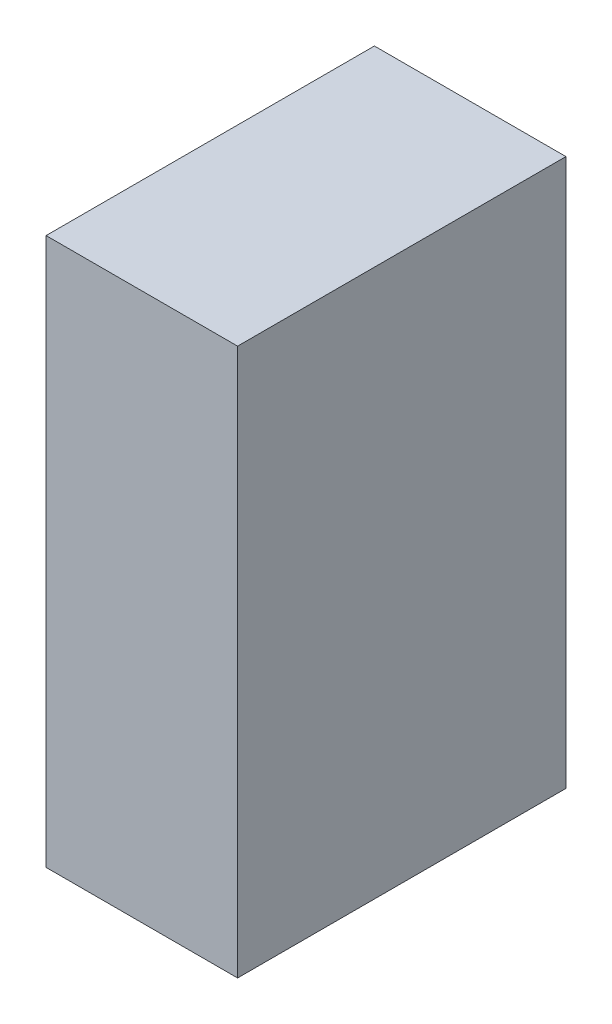
ISO-10303-21;
HEADER;
FILE_DESCRIPTION(('STEP AP214'),'2;1');
FILE_NAME('part.step','',(''),(''),'','','');
FILE_SCHEMA(('AUTOMOTIVE_DESIGN { 1 0 10303 214 1 1 1 1 }'));
ENDSEC;
DATA;
#1=APPLICATION_CONTEXT('core data for automotive mechanical design processes');
#2=APPLICATION_PROTOCOL_DEFINITION('international standard','automotive_design',2000,#1);
#3=PRODUCT_CONTEXT('',#1,'mechanical');
#4=PRODUCT('Part','Part','',(#3));
#5=PRODUCT_RELATED_PRODUCT_CATEGORY('part','',(#4));
#6=PRODUCT_DEFINITION_FORMATION('','',#4);
#7=PRODUCT_DEFINITION_CONTEXT('part definition',#1,'design');
#8=PRODUCT_DEFINITION('design','',#6,#7);
#9=PRODUCT_DEFINITION_SHAPE('','',#8);
#10=(LENGTH_UNIT() NAMED_UNIT(*) SI_UNIT(.MILLI.,.METRE.));
#11=(NAMED_UNIT(*) PLANE_ANGLE_UNIT() SI_UNIT($,.RADIAN.));
#12=(NAMED_UNIT(*) SI_UNIT($,.STERADIAN.) SOLID_ANGLE_UNIT());
#13=UNCERTAINTY_MEASURE_WITH_UNIT(LENGTH_MEASURE(1.E-05),#10,'distance_accuracy_value','');
#14=(GEOMETRIC_REPRESENTATION_CONTEXT(3) GLOBAL_UNCERTAINTY_ASSIGNED_CONTEXT((#13)) GLOBAL_UNIT_ASSIGNED_CONTEXT((#10,
#11,#12)) REPRESENTATION_CONTEXT('',''));
#15=CARTESIAN_POINT('',(0.,0.,0.));
#16=DIRECTION('',(0.,0.,1.));
#17=DIRECTION('',(1.,0.,0.));
#18=AXIS2_PLACEMENT_3D('',#15,#16,#17);
#19=CARTESIAN_POINT('',(610.,180.,-248.));
#20=DIRECTION('',(-1.,0.,0.));
#21=DIRECTION('',(0.,0.,1.));
#22=AXIS2_PLACEMENT_3D('',#19,#20,#21);
#23=PLANE('',#22);
#24=DIRECTION('',(0.,-1.,0.));
#25=VECTOR('',#24,1.);
#26=CARTESIAN_POINT('',(610.,180.,-188.));
#27=LINE('',#26,#25);
#28=CARTESIAN_POINT('',(610.,280.,-188.));
#29=VERTEX_POINT('',#28);
#30=CARTESIAN_POINT('',(610.,180.,-188.));
#31=VERTEX_POINT('',#30);
#32=EDGE_CURVE('E103',#29,#31,#27,.T.);
#33=ORIENTED_EDGE('',*,*,#32,.F.);
#34=DIRECTION('',(0.,0.,1.));
#35=VECTOR('',#34,1.);
#36=CARTESIAN_POINT('',(610.,280.,-248.));
#37=LINE('',#36,#35);
#38=CARTESIAN_POINT('',(610.,280.,-248.));
#39=VERTEX_POINT('',#38);
#40=EDGE_CURVE('E11',#39,#29,#37,.T.);
#41=ORIENTED_EDGE('',*,*,#40,.F.);
#42=DIRECTION('',(0.,-1.,0.));
#43=VECTOR('',#42,1.);
#44=CARTESIAN_POINT('',(610.,180.,-248.));
#45=LINE('',#44,#43);
#46=CARTESIAN_POINT('',(610.,180.,-248.));
#47=VERTEX_POINT('',#46);
#48=EDGE_CURVE('E97',#39,#47,#45,.T.);
#49=ORIENTED_EDGE('',*,*,#48,.T.);
#50=DIRECTION('',(0.,0.,1.));
#51=VECTOR('',#50,1.);
#52=CARTESIAN_POINT('',(610.,180.,-248.));
#53=LINE('',#52,#51);
#54=EDGE_CURVE('E42',#47,#31,#53,.T.);
#55=ORIENTED_EDGE('',*,*,#54,.T.);
#56=EDGE_LOOP('',(#33,#41,#49,#55));
#57=FACE_BOUND('',#56,.T.);
#58=ADVANCED_FACE('F39',(#57),#23,.T.);
#59=CARTESIAN_POINT('',(610.,280.,-248.));
#60=DIRECTION('',(0.,1.,0.));
#61=DIRECTION('',(0.,0.,1.));
#62=AXIS2_PLACEMENT_3D('',#59,#60,#61);
#63=PLANE('',#62);
#64=DIRECTION('',(-1.,0.,0.));
#65=VECTOR('',#64,1.);
#66=CARTESIAN_POINT('',(610.,280.,-188.));
#67=LINE('',#66,#65);
#68=CARTESIAN_POINT('',(645.,280.,-188.));
#69=VERTEX_POINT('',#68);
#70=EDGE_CURVE('E99',#69,#29,#67,.T.);
#71=ORIENTED_EDGE('',*,*,#70,.F.);
#72=DIRECTION('',(0.,0.,1.));
#73=VECTOR('',#72,1.);
#74=CARTESIAN_POINT('',(645.,280.,-248.));
#75=LINE('',#74,#73);
#76=CARTESIAN_POINT('',(645.,280.,-248.));
#77=VERTEX_POINT('',#76);
#78=EDGE_CURVE('E48',#77,#69,#75,.T.);
#79=ORIENTED_EDGE('',*,*,#78,.F.);
#80=DIRECTION('',(-1.,0.,0.));
#81=VECTOR('',#80,1.);
#82=CARTESIAN_POINT('',(610.,280.,-248.));
#83=LINE('',#82,#81);
#84=EDGE_CURVE('E94',#77,#39,#83,.T.);
#85=ORIENTED_EDGE('',*,*,#84,.T.);
#86=ORIENTED_EDGE('',*,*,#40,.T.);
#87=EDGE_LOOP('',(#71,#79,#85,#86));
#88=FACE_BOUND('',#87,.T.);
#89=ADVANCED_FACE('F113',(#88),#63,.T.);
#90=CARTESIAN_POINT('',(645.,180.,-248.));
#91=DIRECTION('',(1.,0.,0.));
#92=DIRECTION('',(0.,0.,-1.));
#93=AXIS2_PLACEMENT_3D('',#90,#91,#92);
#94=PLANE('',#93);
#95=DIRECTION('',(0.,1.,0.));
#96=VECTOR('',#95,1.);
#97=CARTESIAN_POINT('',(645.,180.,-188.));
#98=LINE('',#97,#96);
#99=CARTESIAN_POINT('',(645.,180.,-188.));
#100=VERTEX_POINT('',#99);
#101=EDGE_CURVE('E89',#100,#69,#98,.T.);
#102=ORIENTED_EDGE('',*,*,#101,.F.);
#103=DIRECTION('',(0.,0.,1.));
#104=VECTOR('',#103,1.);
#105=CARTESIAN_POINT('',(645.,180.,-248.));
#106=LINE('',#105,#104);
#107=CARTESIAN_POINT('',(645.,180.,-248.));
#108=VERTEX_POINT('',#107);
#109=EDGE_CURVE('E84',#108,#100,#106,.T.);
#110=ORIENTED_EDGE('',*,*,#109,.F.);
#111=DIRECTION('',(0.,1.,0.));
#112=VECTOR('',#111,1.);
#113=CARTESIAN_POINT('',(645.,180.,-248.));
#114=LINE('',#113,#112);
#115=EDGE_CURVE('E87',#108,#77,#114,.T.);
#116=ORIENTED_EDGE('',*,*,#115,.T.);
#117=ORIENTED_EDGE('',*,*,#78,.T.);
#118=EDGE_LOOP('',(#102,#110,#116,#117));
#119=FACE_BOUND('',#118,.T.);
#120=ADVANCED_FACE('F86',(#119),#94,.T.);
#121=CARTESIAN_POINT('',(610.,180.,-248.));
#122=DIRECTION('',(0.,-1.,0.));
#123=DIRECTION('',(0.,0.,-1.));
#124=AXIS2_PLACEMENT_3D('',#121,#122,#123);
#125=PLANE('',#124);
#126=DIRECTION('',(1.,0.,0.));
#127=VECTOR('',#126,1.);
#128=CARTESIAN_POINT('',(610.,180.,-188.));
#129=LINE('',#128,#127);
#130=EDGE_CURVE('E106',#31,#100,#129,.T.);
#131=ORIENTED_EDGE('',*,*,#130,.F.);
#132=ORIENTED_EDGE('',*,*,#54,.F.);
#133=DIRECTION('',(1.,0.,0.));
#134=VECTOR('',#133,1.);
#135=CARTESIAN_POINT('',(610.,180.,-248.));
#136=LINE('',#135,#134);
#137=EDGE_CURVE('E93',#47,#108,#136,.T.);
#138=ORIENTED_EDGE('',*,*,#137,.T.);
#139=ORIENTED_EDGE('',*,*,#109,.T.);
#140=EDGE_LOOP('',(#131,#132,#138,#139));
#141=FACE_BOUND('',#140,.T.);
#142=ADVANCED_FACE('F96',(#141),#125,.T.);
#143=CARTESIAN_POINT('',(0.,0.,-248.));
#144=DIRECTION('',(0.,0.,-1.));
#145=DIRECTION('',(-1.,0.,0.));
#146=AXIS2_PLACEMENT_3D('',#143,#144,#145);
#147=PLANE('',#146);
#148=ORIENTED_EDGE('',*,*,#48,.F.);
#149=ORIENTED_EDGE('',*,*,#84,.F.);
#150=ORIENTED_EDGE('',*,*,#115,.F.);
#151=ORIENTED_EDGE('',*,*,#137,.F.);
#152=EDGE_LOOP('',(#148,#149,#150,#151));
#153=FACE_BOUND('',#152,.T.);
#154=ADVANCED_FACE('F92',(#153),#147,.T.);
#155=CARTESIAN_POINT('',(0.,0.,-188.));
#156=DIRECTION('',(0.,0.,-1.));
#157=DIRECTION('',(-1.,0.,0.));
#158=AXIS2_PLACEMENT_3D('',#155,#156,#157);
#159=PLANE('',#158);
#160=ORIENTED_EDGE('',*,*,#32,.T.);
#161=ORIENTED_EDGE('',*,*,#130,.T.);
#162=ORIENTED_EDGE('',*,*,#101,.T.);
#163=ORIENTED_EDGE('',*,*,#70,.T.);
#164=EDGE_LOOP('',(#160,#161,#162,#163));
#165=FACE_BOUND('',#164,.T.);
#166=ADVANCED_FACE('F112',(#165),#159,.F.);
#167=CLOSED_SHELL('',(#58,#89,#120,#142,#154,#166));
#168=MANIFOLD_SOLID_BREP('B2',#167);
#169=ADVANCED_BREP_SHAPE_REPRESENTATION('',(#18,#168),#14);
#170=SHAPE_DEFINITION_REPRESENTATION(#9,#169);
ENDSEC;
END-ISO-10303-21;
